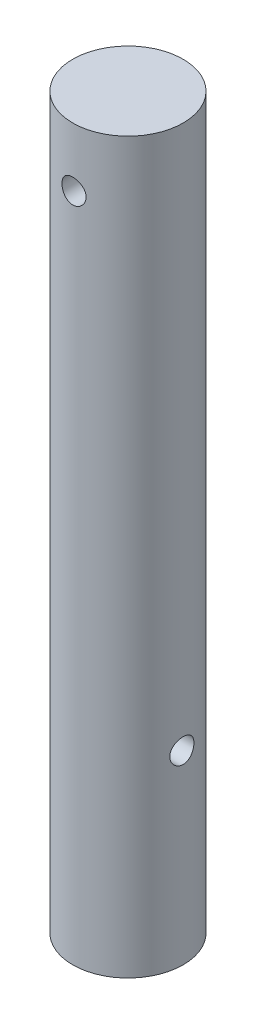
ISO-10303-21;
HEADER;
FILE_DESCRIPTION(('STEP AP214'),'2;1');
FILE_NAME('part.step','',(''),(''),'','','');
FILE_SCHEMA(('AUTOMOTIVE_DESIGN { 1 0 10303 214 1 1 1 1 }'));
ENDSEC;
DATA;
#1=APPLICATION_CONTEXT('core data for automotive mechanical design processes');
#2=APPLICATION_PROTOCOL_DEFINITION('international standard','automotive_design',2000,#1);
#3=PRODUCT_CONTEXT('',#1,'mechanical');
#4=PRODUCT('Part','Part','',(#3));
#5=PRODUCT_RELATED_PRODUCT_CATEGORY('part','',(#4));
#6=PRODUCT_DEFINITION_FORMATION('','',#4);
#7=PRODUCT_DEFINITION_CONTEXT('part definition',#1,'design');
#8=PRODUCT_DEFINITION('design','',#6,#7);
#9=PRODUCT_DEFINITION_SHAPE('','',#8);
#10=(LENGTH_UNIT() NAMED_UNIT(*) SI_UNIT(.MILLI.,.METRE.));
#11=(NAMED_UNIT(*) PLANE_ANGLE_UNIT() SI_UNIT($,.RADIAN.));
#12=(NAMED_UNIT(*) SI_UNIT($,.STERADIAN.) SOLID_ANGLE_UNIT());
#13=UNCERTAINTY_MEASURE_WITH_UNIT(LENGTH_MEASURE(1.E-05),#10,'distance_accuracy_value','');
#14=(GEOMETRIC_REPRESENTATION_CONTEXT(3) GLOBAL_UNCERTAINTY_ASSIGNED_CONTEXT((#13)) GLOBAL_UNIT_ASSIGNED_CONTEXT((#10,
#11,#12)) REPRESENTATION_CONTEXT('',''));
#15=CARTESIAN_POINT('',(0.,0.,0.));
#16=DIRECTION('',(0.,0.,1.));
#17=DIRECTION('',(1.,0.,0.));
#18=AXIS2_PLACEMENT_3D('',#15,#16,#17);
#19=CARTESIAN_POINT('',(0.,-9.525,0.));
#20=DIRECTION('',(0.,1.,0.));
#21=DIRECTION('',(0.,0.,1.));
#22=AXIS2_PLACEMENT_3D('',#19,#20,#21);
#23=CYLINDRICAL_SURFACE('',#22,4.7625);
#24=CARTESIAN_POINT('',(-4.64724566705915,-46.863,-1.0414));
#25=CARTESIAN_POINT('',(-4.64724683426293,-46.8052594354549,-1.04139801362496));
#26=CARTESIAN_POINT('',(-4.64833350092517,-46.7474949910105,-1.03658151779939));
#27=CARTESIAN_POINT('',(-4.65255476760777,-46.6336087908007,-1.01746386740255));
#28=CARTESIAN_POINT('',(-4.6556908487515,-46.5774882537678,-1.00315585314442));
#29=CARTESIAN_POINT('',(-4.66363917155119,-46.4685537577196,-0.965527203784959));
#30=CARTESIAN_POINT('',(-4.66844957404701,-46.4157362452833,-0.942216454681358));
#31=CARTESIAN_POINT('',(-4.679202313415,-46.3147605410028,-0.887272324034088));
#32=CARTESIAN_POINT('',(-4.68514462682847,-46.2666022526281,-0.855639114967133));
#33=CARTESIAN_POINT('',(-4.69760372982455,-46.1754981701297,-0.784378709753431));
#34=CARTESIAN_POINT('',(-4.70412786452575,-46.1326424951388,-0.744637563560157));
#35=CARTESIAN_POINT('',(-4.71695119823604,-46.0541494142651,-0.658535374425396));
#36=CARTESIAN_POINT('',(-4.72325037973522,-46.0185125692768,-0.612173817562527));
#37=CARTESIAN_POINT('',(-4.73499404437961,-45.9551123001179,-0.513542666007839));
#38=CARTESIAN_POINT('',(-4.74042885036034,-45.927435548742,-0.461216106554952));
#39=CARTESIAN_POINT('',(-4.74974844219505,-45.8813018498733,-0.352516010031967));
#40=CARTESIAN_POINT('',(-4.75363340187398,-45.8628438683793,-0.296142927642001));
#41=CARTESIAN_POINT('',(-4.75936366654546,-45.8359550886623,-0.181887019493143));
#42=CARTESIAN_POINT('',(-4.76123996378069,-45.8273717716921,-0.124041667800268));
#43=CARTESIAN_POINT('',(-4.7628488730253,-45.8199991100795,-0.00770365102984375));
#44=CARTESIAN_POINT('',(-4.76258173014628,-45.8212086455823,0.0507889392692712));
#45=CARTESIAN_POINT('',(-4.7599575457801,-45.8332737553604,0.165709632519628));
#46=CARTESIAN_POINT('',(-4.75763612363036,-45.8439649334693,0.222155927894644));
#47=CARTESIAN_POINT('',(-4.75120480370878,-45.874427878627,0.332433306696865));
#48=CARTESIAN_POINT('',(-4.74709482510063,-45.8942000561064,0.386264271798325));
#49=CARTESIAN_POINT('',(-4.7374909127541,-45.9424091815594,0.490239331884415));
#50=CARTESIAN_POINT('',(-4.73198707564586,-45.9709084521832,0.540353578110618));
#51=CARTESIAN_POINT('',(-4.72019893627285,-46.0357163000883,0.635148271211257));
#52=CARTESIAN_POINT('',(-4.71391452779004,-46.0720259406767,0.679827976927225));
#53=CARTESIAN_POINT('',(-4.70110204145526,-46.1523188534707,0.763463015113666));
#54=CARTESIAN_POINT('',(-4.69457161409702,-46.1964460039315,0.802279980264733));
#55=CARTESIAN_POINT('',(-4.68212554890455,-46.2906510439001,0.871988610824726));
#56=CARTESIAN_POINT('',(-4.67620992771903,-46.3407290944775,0.902880061646886));
#57=CARTESIAN_POINT('',(-4.66565707357456,-46.4456380473703,0.95592222957979));
#58=CARTESIAN_POINT('',(-4.66102367598321,-46.5004825776943,0.97804680680204));
#59=CARTESIAN_POINT('',(-4.65361304323723,-46.6132364055119,1.0127238472103));
#60=CARTESIAN_POINT('',(-4.65083551382603,-46.6711452155776,1.0252778279036));
#61=CARTESIAN_POINT('',(-4.64751110841383,-46.7871194979768,1.04024271000873));
#62=CARTESIAN_POINT('',(-4.64691993253734,-46.8451577340028,1.04285508035657));
#63=CARTESIAN_POINT('',(-4.64791567011152,-46.9608404403681,1.03840802942941));
#64=CARTESIAN_POINT('',(-4.6495024340223,-47.0184849374688,1.03134927218535));
#65=CARTESIAN_POINT('',(-4.65463343129432,-47.1310424003158,1.00793513212541));
#66=CARTESIAN_POINT('',(-4.65815428767504,-47.185979611458,0.99169070701029));
#67=CARTESIAN_POINT('',(-4.66673567123808,-47.2923524843477,0.950486488246564));
#68=CARTESIAN_POINT('',(-4.67179634572057,-47.3437878105258,0.925525860765657));
#69=CARTESIAN_POINT('',(-4.68298449147103,-47.4425687414898,0.867153863286206));
#70=CARTESIAN_POINT('',(-4.68912717846546,-47.4898392455922,0.833618379071799));
#71=CARTESIAN_POINT('',(-4.70174708709888,-47.5781556543828,0.75921103069977));
#72=CARTESIAN_POINT('',(-4.7082243501868,-47.6192007853498,0.718338256002518));
#73=CARTESIAN_POINT('',(-4.72092960738021,-47.6946832744679,0.629504904094955));
#74=CARTESIAN_POINT('',(-4.72715070931358,-47.7289832809665,0.581426465048818));
#75=CARTESIAN_POINT('',(-4.73851586605987,-47.7890196640495,0.480073080457866));
#76=CARTESIAN_POINT('',(-4.74365997115273,-47.814756440444,0.426798377672553));
#77=CARTESIAN_POINT('',(-4.75226247126153,-47.8567444874519,0.316896539669138));
#78=CARTESIAN_POINT('',(-4.75573151727163,-47.8730558246138,0.260293224474134));
#79=CARTESIAN_POINT('',(-4.76063908181433,-47.8959175521733,0.145065409410685));
#80=CARTESIAN_POINT('',(-4.76207789535526,-47.9024693607128,0.0864412044614987));
#81=CARTESIAN_POINT('',(-4.76275412632141,-47.9055623173701,-0.0298603228029478));
#82=CARTESIAN_POINT('',(-4.76203664219021,-47.9023085429497,-0.0875320244869774));
#83=CARTESIAN_POINT('',(-4.75857751446408,-47.8863413933666,-0.201485414812264));
#84=CARTESIAN_POINT('',(-4.75583590721532,-47.8736281880621,-0.257767128394096));
#85=CARTESIAN_POINT('',(-4.74863991195574,-47.8392013099453,-0.367184402238855));
#86=CARTESIAN_POINT('',(-4.74419105946765,-47.8175167081639,-0.420329496601131));
#87=CARTESIAN_POINT('',(-4.73405565817542,-47.765790934413,-0.522254272086121));
#88=CARTESIAN_POINT('',(-4.72836898931314,-47.7357489517668,-0.571033529110016));
#89=CARTESIAN_POINT('',(-4.71624362983928,-47.6674924311219,-0.66384231669472));
#90=CARTESIAN_POINT('',(-4.70979271994042,-47.6291336727227,-0.707764193111468));
#91=CARTESIAN_POINT('',(-4.69693179793269,-47.5456233784584,-0.78861772566919));
#92=CARTESIAN_POINT('',(-4.69052179605622,-47.5004702075537,-0.825547694400661));
#93=CARTESIAN_POINT('',(-4.67837298924523,-47.403927290551,-0.891844453069654));
#94=CARTESIAN_POINT('',(-4.67264429711009,-47.3524622742865,-0.921103592206115));
#95=CARTESIAN_POINT('',(-4.66263389205707,-47.2452313088032,-0.97051110043285));
#96=CARTESIAN_POINT('',(-4.6583509550351,-47.1894690474029,-0.990667181888034));
#97=CARTESIAN_POINT('',(-4.65250901438367,-47.0885415511845,-1.01769701357225));
#98=CARTESIAN_POINT('',(-4.65054835699366,-47.0439238549312,-1.02656858972862));
#99=CARTESIAN_POINT('',(-4.64791625537895,-46.9538756769008,-1.03842072126472));
#100=CARTESIAN_POINT('',(-4.64724474840082,-46.9084452347952,-1.04140156339449));
#101=CARTESIAN_POINT('',(-4.64724566705915,-46.863,-1.0414));
#102=B_SPLINE_CURVE_WITH_KNOTS('',3,(#24,#25,#26,#27,#28,#29,#30,#31,#32,#33,#34,#35,#36,#37,
#38,#39,#40,#41,#42,#43,#44,#45,#46,#47,#48,#49,#50,#51,#52,#53,#54,#55,#56,#57,#58,#59,#60,#61,
#62,#63,#64,#65,#66,#67,#68,#69,#70,#71,#72,#73,#74,#75,#76,#77,#78,#79,#80,#81,#82,#83,#84,#85,
#86,#87,#88,#89,#90,#91,#92,#93,#94,#95,#96,#97,#98,#99,#100,#101),.UNSPECIFIED.,.T.,.F.,(4,2,2,
2,2,2,2,2,2,2,2,2,2,2,2,2,2,2,2,2,2,2,2,2,2,2,2,2,2,2,2,2,2,2,2,2,2,2,4),(0.,0.173055140300116,
0.346235487043308,0.519226200880875,0.69221332989857,0.867823714054951,1.0434477377038,
1.22091729879004,1.39836694995534,1.57303737128947,1.74768781859339,1.9193680553078,
2.0910560521551,2.26399990258393,2.43696731257987,2.61353176331568,2.79010099410679,
2.96719280369704,3.1442565278867,3.31771229626417,3.4911561555624,3.66254834344323,
3.83395693198865,4.00800281298307,4.18207030759133,4.35938074440266,4.53668290157354,
4.71284231692531,4.88897613232749,5.06145196582417,5.23392470233289,5.40584287971858,
5.57777773920591,5.75297415311241,5.92821279473666,6.10579293444732,6.28322233975766,
6.41943358750539,6.55563820457845),.UNSPECIFIED.);
#103=CARTESIAN_POINT('',(-4.64724566705915,-46.863,-1.0414));
#104=VERTEX_POINT('',#103);
#105=EDGE_CURVE('E85',#104,#104,#102,.T.);
#106=ORIENTED_EDGE('',*,*,#105,.T.);
#107=EDGE_LOOP('',(#106));
#108=FACE_BOUND('',#107,.T.);
#109=CARTESIAN_POINT('',(4.64724566705915,-46.863,1.0414));
#110=CARTESIAN_POINT('',(4.64724683426293,-46.9207405645451,1.04139801362496));
#111=CARTESIAN_POINT('',(4.64833350092517,-46.9785050089895,1.03658151779939));
#112=CARTESIAN_POINT('',(4.65255476760777,-47.0923912091993,1.01746386740255));
#113=CARTESIAN_POINT('',(4.6556908487515,-47.1485117462322,1.00315585314442));
#114=CARTESIAN_POINT('',(4.66363917155119,-47.2574462422804,0.965527203784959));
#115=CARTESIAN_POINT('',(4.66844957404701,-47.3102637547167,0.942216454681361));
#116=CARTESIAN_POINT('',(4.679202313415,-47.4112394589972,0.887272324034091));
#117=CARTESIAN_POINT('',(4.68514462682847,-47.4593977473719,0.855639114967134));
#118=CARTESIAN_POINT('',(4.69760372982455,-47.5505018298703,0.78437870975343));
#119=CARTESIAN_POINT('',(4.70412786452575,-47.5933575048612,0.744637563560156));
#120=CARTESIAN_POINT('',(4.71695119823604,-47.671850585735,0.658535374425396));
#121=CARTESIAN_POINT('',(4.72325037973522,-47.7074874307232,0.612173817562527));
#122=CARTESIAN_POINT('',(4.73499404437961,-47.7708876998821,0.51354266600784));
#123=CARTESIAN_POINT('',(4.74042885036034,-47.798564451258,0.461216106554953));
#124=CARTESIAN_POINT('',(4.74974844219505,-47.8446981501267,0.352516010031967));
#125=CARTESIAN_POINT('',(4.75363340187398,-47.8631561316207,0.296142927642001));
#126=CARTESIAN_POINT('',(4.75936366654546,-47.8900449113377,0.181887019493144));
#127=CARTESIAN_POINT('',(4.76123996378069,-47.8986282283079,0.124041667800269));
#128=CARTESIAN_POINT('',(4.7628488730253,-47.9060008899205,0.00770365102984466));
#129=CARTESIAN_POINT('',(4.76258173014628,-47.9047913544177,-0.0507889392692702));
#130=CARTESIAN_POINT('',(4.7599575457801,-47.8927262446396,-0.165709632519627));
#131=CARTESIAN_POINT('',(4.75763612363036,-47.8820350665307,-0.222155927894643));
#132=CARTESIAN_POINT('',(4.75120480370878,-47.851572121373,-0.332433306696864));
#133=CARTESIAN_POINT('',(4.74709482510063,-47.8317999438936,-0.386264271798325));
#134=CARTESIAN_POINT('',(4.7374909127541,-47.7835908184406,-0.490239331884412));
#135=CARTESIAN_POINT('',(4.73198707564586,-47.7550915478168,-0.540353578110612));
#136=CARTESIAN_POINT('',(4.72019893627285,-47.6902836999118,-0.635148271211252));
#137=CARTESIAN_POINT('',(4.71391452779004,-47.6539740593234,-0.679827976927223));
#138=CARTESIAN_POINT('',(4.70110204145526,-47.5736811465293,-0.763463015113663));
#139=CARTESIAN_POINT('',(4.69457161409703,-47.5295539960686,-0.802279980264726));
#140=CARTESIAN_POINT('',(4.68212554890455,-47.4353489561,-0.87198861082472));
#141=CARTESIAN_POINT('',(4.67620992771903,-47.3852709055226,-0.902880061646884));
#142=CARTESIAN_POINT('',(4.66565707357456,-47.2803619526297,-0.95592222957979));
#143=CARTESIAN_POINT('',(4.66102367598321,-47.2255174223057,-0.97804680680204));
#144=CARTESIAN_POINT('',(4.65361304323723,-47.1127635944881,-1.0127238472103));
#145=CARTESIAN_POINT('',(4.65083551382603,-47.0548547844224,-1.0252778279036));
#146=CARTESIAN_POINT('',(4.64751110841383,-46.9388805020232,-1.04024271000873));
#147=CARTESIAN_POINT('',(4.64691993253734,-46.8808422659972,-1.04285508035657));
#148=CARTESIAN_POINT('',(4.64791567011152,-46.7651595596319,-1.03840802942941));
#149=CARTESIAN_POINT('',(4.6495024340223,-46.7075150625312,-1.03134927218535));
#150=CARTESIAN_POINT('',(4.65463343129432,-46.5949575996842,-1.00793513212541));
#151=CARTESIAN_POINT('',(4.65815428767504,-46.540020388542,-0.991690707010291));
#152=CARTESIAN_POINT('',(4.66673567123808,-46.4336475156523,-0.950486488246564));
#153=CARTESIAN_POINT('',(4.67179634572057,-46.3822121894742,-0.925525860765656));
#154=CARTESIAN_POINT('',(4.68298449147103,-46.2834312585102,-0.867153863286207));
#155=CARTESIAN_POINT('',(4.68912717846546,-46.2361607544078,-0.833618379071802));
#156=CARTESIAN_POINT('',(4.70174708709888,-46.1478443456172,-0.759211030699773));
#157=CARTESIAN_POINT('',(4.7082243501868,-46.1067992146502,-0.718338256002519));
#158=CARTESIAN_POINT('',(4.72092960738021,-46.0313167255321,-0.629504904094953));
#159=CARTESIAN_POINT('',(4.72715070931358,-45.9970167190335,-0.581426465048817));
#160=CARTESIAN_POINT('',(4.73851586605987,-45.9369803359505,-0.480073080457864));
#161=CARTESIAN_POINT('',(4.74365997115273,-45.911243559556,-0.426798377672552));
#162=CARTESIAN_POINT('',(4.75226247126153,-45.8692555125481,-0.316896539669137));
#163=CARTESIAN_POINT('',(4.75573151727163,-45.8529441753862,-0.260293224474134));
#164=CARTESIAN_POINT('',(4.76063908181433,-45.8300824478267,-0.145065409410685));
#165=CARTESIAN_POINT('',(4.76207789535526,-45.8235306392872,-0.0864412044614986));
#166=CARTESIAN_POINT('',(4.76275412632141,-45.8204376826299,0.0298603228029479));
#167=CARTESIAN_POINT('',(4.76203664219021,-45.8236914570503,0.0875320244869773));
#168=CARTESIAN_POINT('',(4.75857751446408,-45.8396586066334,0.201485414812263));
#169=CARTESIAN_POINT('',(4.75583590721532,-45.8523718119379,0.257767128394096));
#170=CARTESIAN_POINT('',(4.74863991195574,-45.8867986900547,0.367184402238855));
#171=CARTESIAN_POINT('',(4.74419105946765,-45.9084832918361,0.420329496601131));
#172=CARTESIAN_POINT('',(4.73405565817542,-45.960209065587,0.522254272086121));
#173=CARTESIAN_POINT('',(4.72836898931314,-45.9902510482332,0.571033529110016));
#174=CARTESIAN_POINT('',(4.71624362983928,-46.0585075688781,0.66384231669472));
#175=CARTESIAN_POINT('',(4.70979271994042,-46.0968663272773,0.707764193111468));
#176=CARTESIAN_POINT('',(4.69693179793269,-46.1803766215417,0.788617725669189));
#177=CARTESIAN_POINT('',(4.69052179605622,-46.2255297924464,0.825547694400661));
#178=CARTESIAN_POINT('',(4.67837298924523,-46.322072709449,0.891844453069654));
#179=CARTESIAN_POINT('',(4.67264429711009,-46.3735377257135,0.921103592206115));
#180=CARTESIAN_POINT('',(4.66263389205707,-46.4807686911968,0.97051110043285));
#181=CARTESIAN_POINT('',(4.6583509550351,-46.5365309525971,0.990667181888033));
#182=CARTESIAN_POINT('',(4.65250901438367,-46.6374584488155,1.01769701357225));
#183=CARTESIAN_POINT('',(4.65054835699367,-46.6820761450687,1.02656858972861));
#184=CARTESIAN_POINT('',(4.64791625537895,-46.7721243230992,1.03842072126472));
#185=CARTESIAN_POINT('',(4.64724474840082,-46.8175547652048,1.04140156339449));
#186=CARTESIAN_POINT('',(4.64724566705915,-46.863,1.0414));
#187=B_SPLINE_CURVE_WITH_KNOTS('',3,(#109,#110,#111,#112,#113,#114,#115,#116,#117,#118,#119,
#120,#121,#122,#123,#124,#125,#126,#127,#128,#129,#130,#131,#132,#133,#134,#135,#136,#137,#138,
#139,#140,#141,#142,#143,#144,#145,#146,#147,#148,#149,#150,#151,#152,#153,#154,#155,#156,#157,
#158,#159,#160,#161,#162,#163,#164,#165,#166,#167,#168,#169,#170,#171,#172,#173,#174,#175,#176,
#177,#178,#179,#180,#181,#182,#183,#184,#185,#186),.UNSPECIFIED.,.T.,.F.,(4,2,2,2,2,2,2,2,2,2,2,
2,2,2,2,2,2,2,2,2,2,2,2,2,2,2,2,2,2,2,2,2,2,2,2,2,2,2,4),(0.,0.173055140300116,
0.346235487043308,0.519226200880874,0.692213329898571,0.867823714054952,1.0434477377038,
1.22091729879004,1.39836694995534,1.57303737128947,1.74768781859339,1.9193680553078,
2.0910560521551,2.26399990258392,2.43696731257987,2.61353176331566,2.79010099410679,
2.96719280369704,3.1442565278867,3.31771229626417,3.4911561555624,3.66254834344323,
3.83395693198865,4.00800281298306,4.18207030759133,4.35938074440266,4.53668290157354,
4.71284231692531,4.88897613232749,5.06145196582417,5.23392470233289,5.40584287971858,
5.57777773920591,5.75297415311241,5.92821279473666,6.10579293444732,6.28322233975766,
6.41943358750537,6.55563820457845),.UNSPECIFIED.);
#188=CARTESIAN_POINT('',(4.64724566705915,-46.863,1.0414));
#189=VERTEX_POINT('',#188);
#190=EDGE_CURVE('E89',#189,#189,#187,.T.);
#191=ORIENTED_EDGE('',*,*,#190,.F.);
#192=EDGE_LOOP('',(#191));
#193=FACE_BOUND('',#192,.T.);
#194=CARTESIAN_POINT('',(-1.0414,-5.08,4.64724566705915));
#195=CARTESIAN_POINT('',(-1.04139801362496,-5.1377405645451,4.64724683426293));
#196=CARTESIAN_POINT('',(-1.03658151779939,-5.19550500898947,4.64833350092517));
#197=CARTESIAN_POINT('',(-1.01746386740255,-5.30939120919932,4.65255476760777));
#198=CARTESIAN_POINT('',(-1.00315585314442,-5.36551174623215,4.6556908487515));
#199=CARTESIAN_POINT('',(-0.965527203784957,-5.47444624228043,4.66363917155119));
#200=CARTESIAN_POINT('',(-0.942216454681359,-5.52726375471671,4.66844957404701));
#201=CARTESIAN_POINT('',(-0.88727232403409,-5.62823945899716,4.679202313415));
#202=CARTESIAN_POINT('',(-0.855639114967134,-5.67639774737194,4.68514462682847));
#203=CARTESIAN_POINT('',(-0.784378709753432,-5.76750182987032,4.69760372982455));
#204=CARTESIAN_POINT('',(-0.744637563560157,-5.81035750486115,4.70412786452575));
#205=CARTESIAN_POINT('',(-0.658535374425396,-5.88885058573494,4.71695119823604));
#206=CARTESIAN_POINT('',(-0.612173817562526,-5.92448743072324,4.72325037973522));
#207=CARTESIAN_POINT('',(-0.513542666007838,-5.98788769988214,4.73499404437961));
#208=CARTESIAN_POINT('',(-0.461216106554951,-6.01556445125803,4.74042885036034));
#209=CARTESIAN_POINT('',(-0.352516010031965,-6.06169815012671,4.74974844219505));
#210=CARTESIAN_POINT('',(-0.296142927641999,-6.08015613162073,4.75363340187398));
#211=CARTESIAN_POINT('',(-0.181887019493141,-6.10704491133772,4.75936366654545));
#212=CARTESIAN_POINT('',(-0.124041667800267,-6.11562822830789,4.76123996378069));
#213=CARTESIAN_POINT('',(-0.00770365102984294,-6.12300088992053,4.7628488730253));
#214=CARTESIAN_POINT('',(0.0507889392692714,-6.12179135441771,4.76258173014628));
#215=CARTESIAN_POINT('',(0.165709632519628,-6.10972624463959,4.7599575457801));
#216=CARTESIAN_POINT('',(0.222155927894645,-6.09903506653072,4.75763612363036));
#217=CARTESIAN_POINT('',(0.332433306696866,-6.06857212137304,4.75120480370878));
#218=CARTESIAN_POINT('',(0.386264271798326,-6.0487999438936,4.74709482510063));
#219=CARTESIAN_POINT('',(0.490239331884414,-6.0005908184406,4.7374909127541));
#220=CARTESIAN_POINT('',(0.540353578110617,-5.97209154781684,4.73198707564586));
#221=CARTESIAN_POINT('',(0.635148271211256,-5.90728369991175,4.72019893627285));
#222=CARTESIAN_POINT('',(0.679827976927225,-5.87097405932335,4.71391452779004));
#223=CARTESIAN_POINT('',(0.763463015113664,-5.79068114652927,4.70110204145526));
#224=CARTESIAN_POINT('',(0.802279980264728,-5.74655399606855,4.69457161409702));
#225=CARTESIAN_POINT('',(0.871988610824721,-5.65234895609995,4.68212554890455));
#226=CARTESIAN_POINT('',(0.902880061646884,-5.60227090552255,4.67620992771903));
#227=CARTESIAN_POINT('',(0.955922229579789,-5.49736195262965,4.66565707357456));
#228=CARTESIAN_POINT('',(0.978046806802039,-5.44251742230574,4.66102367598321));
#229=CARTESIAN_POINT('',(1.0127238472103,-5.32976359448813,4.65361304323723));
#230=CARTESIAN_POINT('',(1.0252778279036,-5.27185478442239,4.65083551382603));
#231=CARTESIAN_POINT('',(1.04024271000873,-5.15588050202321,4.64751110841383));
#232=CARTESIAN_POINT('',(1.04285508035657,-5.09784226599718,4.64691993253734));
#233=CARTESIAN_POINT('',(1.03840802942941,-4.98215955963193,4.64791567011152));
#234=CARTESIAN_POINT('',(1.03134927218535,-4.92451506253123,4.6495024340223));
#235=CARTESIAN_POINT('',(1.00793513212541,-4.81195759968417,4.65463343129432));
#236=CARTESIAN_POINT('',(0.99169070701029,-4.75702038854196,4.65815428767504));
#237=CARTESIAN_POINT('',(0.950486488246564,-4.65064751565233,4.66673567123808));
#238=CARTESIAN_POINT('',(0.925525860765655,-4.59921218947419,4.67179634572057));
#239=CARTESIAN_POINT('',(0.867153863286205,-4.50043125851024,4.68298449147103));
#240=CARTESIAN_POINT('',(0.8336183790718,-4.45316075440777,4.68912717846546));
#241=CARTESIAN_POINT('',(0.75921103069977,-4.36484434561723,4.70174708709888));
#242=CARTESIAN_POINT('',(0.718338256002515,-4.32379921465023,4.7082243501868));
#243=CARTESIAN_POINT('',(0.62950490409495,-4.24831672553206,4.72092960738021));
#244=CARTESIAN_POINT('',(0.581426465048814,-4.21401671903347,4.72715070931358));
#245=CARTESIAN_POINT('',(0.480073080457863,-4.15398033595051,4.73851586605987));
#246=CARTESIAN_POINT('',(0.426798377672552,-4.12824355955597,4.74365997115273));
#247=CARTESIAN_POINT('',(0.316896539669137,-4.0862555125481,4.75226247126153));
#248=CARTESIAN_POINT('',(0.260293224474134,-4.06994417538617,4.75573151727163));
#249=CARTESIAN_POINT('',(0.145065409410684,-4.04708244782672,4.76063908181433));
#250=CARTESIAN_POINT('',(0.0864412044614981,-4.04053063928721,4.76207789535526));
#251=CARTESIAN_POINT('',(-0.0298603228029482,-4.03743768262992,4.76275412632141));
#252=CARTESIAN_POINT('',(-0.0875320244869775,-4.04069145705028,4.76203664219021));
#253=CARTESIAN_POINT('',(-0.201485414812264,-4.05665860663344,4.75857751446408));
#254=CARTESIAN_POINT('',(-0.257767128394097,-4.06937181193795,4.75583590721532));
#255=CARTESIAN_POINT('',(-0.367184402238857,-4.10379869005474,4.74863991195574));
#256=CARTESIAN_POINT('',(-0.420329496601133,-4.12548329183608,4.74419105946765));
#257=CARTESIAN_POINT('',(-0.522254272086122,-4.17720906558699,4.73405565817542));
#258=CARTESIAN_POINT('',(-0.571033529110016,-4.2072510482332,4.72836898931314));
#259=CARTESIAN_POINT('',(-0.663842316694721,-4.27550756887815,4.71624362983928));
#260=CARTESIAN_POINT('',(-0.70776419311147,-4.31386632727733,4.70979271994042));
#261=CARTESIAN_POINT('',(-0.788617725669192,-4.39737662154165,4.69693179793269));
#262=CARTESIAN_POINT('',(-0.825547694400662,-4.44252979244635,4.69052179605622));
#263=CARTESIAN_POINT('',(-0.891844453069654,-4.53907270944899,4.67837298924523));
#264=CARTESIAN_POINT('',(-0.921103592206116,-4.59053772571349,4.67264429711009));
#265=CARTESIAN_POINT('',(-0.970511100432851,-4.69776869119684,4.66263389205707));
#266=CARTESIAN_POINT('',(-0.990667181888034,-4.75353095259707,4.6583509550351));
#267=CARTESIAN_POINT('',(-1.01769701357225,-4.85445844881553,4.65250901438367));
#268=CARTESIAN_POINT('',(-1.02656858972861,-4.89907614506876,4.65054835699367));
#269=CARTESIAN_POINT('',(-1.03842072126472,-4.98912432309922,4.64791625537895));
#270=CARTESIAN_POINT('',(-1.04140156339449,-5.03455476520484,4.64724474840082));
#271=CARTESIAN_POINT('',(-1.0414,-5.08,4.64724566705915));
#272=B_SPLINE_CURVE_WITH_KNOTS('',3,(#194,#195,#196,#197,#198,#199,#200,#201,#202,#203,#204,
#205,#206,#207,#208,#209,#210,#211,#212,#213,#214,#215,#216,#217,#218,#219,#220,#221,#222,#223,
#224,#225,#226,#227,#228,#229,#230,#231,#232,#233,#234,#235,#236,#237,#238,#239,#240,#241,#242,
#243,#244,#245,#246,#247,#248,#249,#250,#251,#252,#253,#254,#255,#256,#257,#258,#259,#260,#261,
#262,#263,#264,#265,#266,#267,#268,#269,#270,#271),.UNSPECIFIED.,.T.,.F.,(4,2,2,2,2,2,2,2,2,2,2,
2,2,2,2,2,2,2,2,2,2,2,2,2,2,2,2,2,2,2,2,2,2,2,2,2,2,2,4),(0.,0.173055140300112,0.34623548704331,
0.519226200880874,0.692213329898566,0.867823714054948,1.0434477377038,1.22091729879004,
1.39836694995534,1.57303737128947,1.74768781859339,1.9193680553078,2.09105605215509,
2.26399990258392,2.43696731257987,2.61353176331566,2.79010099410678,2.96719280369704,
3.1442565278867,3.31771229626416,3.4911561555624,3.66254834344322,3.83395693198864,
4.00800281298306,4.18207030759133,4.35938074440266,4.53668290157354,4.7128423169253,
4.88897613232748,5.06145196582416,5.23392470233288,5.40584287971857,5.5777777392059,
5.7529741531124,5.92821279473666,6.10579293444731,6.28322233975766,6.41943358750538,
6.55563820457844),.UNSPECIFIED.);
#273=CARTESIAN_POINT('',(-1.0414,-5.08,4.64724566705915));
#274=VERTEX_POINT('',#273);
#275=EDGE_CURVE('E54',#274,#274,#272,.T.);
#276=ORIENTED_EDGE('',*,*,#275,.F.);
#277=EDGE_LOOP('',(#276));
#278=FACE_BOUND('',#277,.T.);
#279=CARTESIAN_POINT('',(1.0414,-5.08,-4.64724566705915));
#280=CARTESIAN_POINT('',(1.04139801362496,-5.02225943545491,-4.64724683426293));
#281=CARTESIAN_POINT('',(1.03658151779939,-4.96449499101053,-4.64833350092517));
#282=CARTESIAN_POINT('',(1.01746386740255,-4.85060879080068,-4.65255476760777));
#283=CARTESIAN_POINT('',(1.00315585314442,-4.79448825376785,-4.6556908487515));
#284=CARTESIAN_POINT('',(0.965527203784957,-4.68555375771957,-4.66363917155119));
#285=CARTESIAN_POINT('',(0.942216454681358,-4.63273624528329,-4.66844957404701));
#286=CARTESIAN_POINT('',(0.88727232403409,-4.53176054100285,-4.679202313415));
#287=CARTESIAN_POINT('',(0.855639114967134,-4.48360225262806,-4.68514462682847));
#288=CARTESIAN_POINT('',(0.784378709753432,-4.39249817012968,-4.69760372982455));
#289=CARTESIAN_POINT('',(0.744637563560157,-4.34964249513885,-4.70412786452575));
#290=CARTESIAN_POINT('',(0.658535374425396,-4.27114941426506,-4.71695119823604));
#291=CARTESIAN_POINT('',(0.612173817562527,-4.23551256927676,-4.72325037973522));
#292=CARTESIAN_POINT('',(0.513542666007839,-4.17211230011786,-4.73499404437961));
#293=CARTESIAN_POINT('',(0.461216106554952,-4.14443554874197,-4.74042885036034));
#294=CARTESIAN_POINT('',(0.352516010031965,-4.09830184987329,-4.74974844219505));
#295=CARTESIAN_POINT('',(0.296142927641999,-4.07984386837927,-4.75363340187398));
#296=CARTESIAN_POINT('',(0.181887019493142,-4.05295508866228,-4.75936366654545));
#297=CARTESIAN_POINT('',(0.124041667800267,-4.04437177169211,-4.76123996378069));
#298=CARTESIAN_POINT('',(0.00770365102984329,-4.03699911007947,-4.7628488730253));
#299=CARTESIAN_POINT('',(-0.050788939269271,-4.03820864558229,-4.76258173014628));
#300=CARTESIAN_POINT('',(-0.165709632519628,-4.05027375536041,-4.7599575457801));
#301=CARTESIAN_POINT('',(-0.222155927894644,-4.06096493346928,-4.75763612363036));
#302=CARTESIAN_POINT('',(-0.332433306696865,-4.09142787862696,-4.75120480370878));
#303=CARTESIAN_POINT('',(-0.386264271798326,-4.11120005610639,-4.74709482510063));
#304=CARTESIAN_POINT('',(-0.490239331884414,-4.15940918155941,-4.7374909127541));
#305=CARTESIAN_POINT('',(-0.540353578110617,-4.18790845218316,-4.73198707564586));
#306=CARTESIAN_POINT('',(-0.635148271211256,-4.25271630008825,-4.72019893627285));
#307=CARTESIAN_POINT('',(-0.679827976927225,-4.28902594067665,-4.71391452779004));
#308=CARTESIAN_POINT('',(-0.763463015113664,-4.36931885347073,-4.70110204145526));
#309=CARTESIAN_POINT('',(-0.802279980264728,-4.41344600393145,-4.69457161409702));
#310=CARTESIAN_POINT('',(-0.871988610824721,-4.50765104390005,-4.68212554890455));
#311=CARTESIAN_POINT('',(-0.902880061646884,-4.55772909447745,-4.67620992771903));
#312=CARTESIAN_POINT('',(-0.955922229579789,-4.66263804737035,-4.66565707357456));
#313=CARTESIAN_POINT('',(-0.978046806802039,-4.71748257769426,-4.66102367598321));
#314=CARTESIAN_POINT('',(-1.0127238472103,-4.83023640551187,-4.65361304323723));
#315=CARTESIAN_POINT('',(-1.0252778279036,-4.88814521557761,-4.65083551382603));
#316=CARTESIAN_POINT('',(-1.04024271000873,-5.00411949797679,-4.64751110841383));
#317=CARTESIAN_POINT('',(-1.04285508035657,-5.06215773400282,-4.64691993253734));
#318=CARTESIAN_POINT('',(-1.03840802942941,-5.17784044036808,-4.64791567011152));
#319=CARTESIAN_POINT('',(-1.03134927218535,-5.23548493746877,-4.6495024340223));
#320=CARTESIAN_POINT('',(-1.00793513212541,-5.34804240031583,-4.65463343129432));
#321=CARTESIAN_POINT('',(-0.99169070701029,-5.40297961145804,-4.65815428767504));
#322=CARTESIAN_POINT('',(-0.950486488246564,-5.50935248434767,-4.66673567123808));
#323=CARTESIAN_POINT('',(-0.925525860765655,-5.56078781052581,-4.67179634572057));
#324=CARTESIAN_POINT('',(-0.867153863286206,-5.65956874148976,-4.68298449147103));
#325=CARTESIAN_POINT('',(-0.8336183790718,-5.70683924559223,-4.68912717846546));
#326=CARTESIAN_POINT('',(-0.759211030699769,-5.79515565438277,-4.70174708709888));
#327=CARTESIAN_POINT('',(-0.718338256002515,-5.83620078534977,-4.7082243501868));
#328=CARTESIAN_POINT('',(-0.62950490409495,-5.91168327446794,-4.72092960738021));
#329=CARTESIAN_POINT('',(-0.581426465048814,-5.94598328096653,-4.72715070931358));
#330=CARTESIAN_POINT('',(-0.480073080457863,-6.00601966404949,-4.73851586605987));
#331=CARTESIAN_POINT('',(-0.426798377672552,-6.03175644044403,-4.74365997115273));
#332=CARTESIAN_POINT('',(-0.316896539669137,-6.0737444874519,-4.75226247126153));
#333=CARTESIAN_POINT('',(-0.260293224474134,-6.09005582461383,-4.75573151727163));
#334=CARTESIAN_POINT('',(-0.145065409410684,-6.11291755217328,-4.76063908181433));
#335=CARTESIAN_POINT('',(-0.086441204461498,-6.11946936071279,-4.76207789535526));
#336=CARTESIAN_POINT('',(0.0298603228029482,-6.12256231737008,-4.76275412632141));
#337=CARTESIAN_POINT('',(0.0875320244869776,-6.11930854294972,-4.76203664219021));
#338=CARTESIAN_POINT('',(0.201485414812264,-6.10334139336656,-4.75857751446408));
#339=CARTESIAN_POINT('',(0.257767128394097,-6.09062818806206,-4.75583590721532));
#340=CARTESIAN_POINT('',(0.367184402238857,-6.05620130994526,-4.74863991195574));
#341=CARTESIAN_POINT('',(0.420329496601133,-6.03451670816392,-4.74419105946765));
#342=CARTESIAN_POINT('',(0.522254272086122,-5.98279093441301,-4.73405565817542));
#343=CARTESIAN_POINT('',(0.571033529110016,-5.9527489517668,-4.72836898931314));
#344=CARTESIAN_POINT('',(0.663842316694721,-5.88449243112185,-4.71624362983928));
#345=CARTESIAN_POINT('',(0.70776419311147,-5.84613367272267,-4.70979271994042));
#346=CARTESIAN_POINT('',(0.788617725669192,-5.76262337845835,-4.69693179793269));
#347=CARTESIAN_POINT('',(0.825547694400662,-5.71747020755365,-4.69052179605622));
#348=CARTESIAN_POINT('',(0.891844453069654,-5.62092729055102,-4.67837298924523));
#349=CARTESIAN_POINT('',(0.921103592206116,-5.56946227428651,-4.67264429711009));
#350=CARTESIAN_POINT('',(0.970511100432851,-5.46223130880316,-4.66263389205707));
#351=CARTESIAN_POINT('',(0.990667181888034,-5.40646904740293,-4.6583509550351));
#352=CARTESIAN_POINT('',(1.01769701357225,-5.30554155118447,-4.65250901438367));
#353=CARTESIAN_POINT('',(1.02656858972861,-5.26092385493124,-4.65054835699367));
#354=CARTESIAN_POINT('',(1.03842072126472,-5.17087567690078,-4.64791625537895));
#355=CARTESIAN_POINT('',(1.04140156339449,-5.12544523479516,-4.64724474840082));
#356=CARTESIAN_POINT('',(1.0414,-5.08,-4.64724566705915));
#357=B_SPLINE_CURVE_WITH_KNOTS('',3,(#279,#280,#281,#282,#283,#284,#285,#286,#287,#288,#289,
#290,#291,#292,#293,#294,#295,#296,#297,#298,#299,#300,#301,#302,#303,#304,#305,#306,#307,#308,
#309,#310,#311,#312,#313,#314,#315,#316,#317,#318,#319,#320,#321,#322,#323,#324,#325,#326,#327,
#328,#329,#330,#331,#332,#333,#334,#335,#336,#337,#338,#339,#340,#341,#342,#343,#344,#345,#346,
#347,#348,#349,#350,#351,#352,#353,#354,#355,#356),.UNSPECIFIED.,.T.,.F.,(4,2,2,2,2,2,2,2,2,2,2,
2,2,2,2,2,2,2,2,2,2,2,2,2,2,2,2,2,2,2,2,2,2,2,2,2,2,2,4),(0.,0.173055140300112,0.34623548704331,
0.519226200880874,0.692213329898566,0.867823714054948,1.0434477377038,1.22091729879004,
1.39836694995534,1.57303737128947,1.74768781859339,1.9193680553078,2.09105605215509,
2.26399990258392,2.43696731257987,2.61353176331566,2.79010099410678,2.96719280369704,
3.1442565278867,3.31771229626416,3.4911561555624,3.66254834344322,3.83395693198864,
4.00800281298306,4.18207030759133,4.35938074440266,4.53668290157354,4.7128423169253,
4.88897613232748,5.06145196582416,5.23392470233288,5.40584287971857,5.5777777392059,
5.7529741531124,5.92821279473666,6.10579293444731,6.28322233975766,6.41943358750538,
6.55563820457844),.UNSPECIFIED.);
#358=CARTESIAN_POINT('',(1.0414,-5.08,-4.64724566705915));
#359=VERTEX_POINT('',#358);
#360=EDGE_CURVE('E49',#359,#359,#357,.T.);
#361=ORIENTED_EDGE('',*,*,#360,.T.);
#362=EDGE_LOOP('',(#361));
#363=FACE_BOUND('',#362,.T.);
#364=CARTESIAN_POINT('',(0.,0.,0.));
#365=DIRECTION('',(0.,1.,0.));
#366=DIRECTION('',(0.,0.,1.));
#367=AXIS2_PLACEMENT_3D('',#364,#365,#366);
#368=CIRCLE('',#367,4.7625);
#369=CARTESIAN_POINT('',(0.,0.,4.7625));
#370=VERTEX_POINT('',#369);
#371=EDGE_CURVE('E10',#370,#370,#368,.T.);
#372=ORIENTED_EDGE('',*,*,#371,.F.);
#373=EDGE_LOOP('',(#372));
#374=FACE_BOUND('',#373,.T.);
#375=CARTESIAN_POINT('',(0.,-62.865,0.));
#376=DIRECTION('',(0.,-1.,0.));
#377=DIRECTION('',(0.,0.,-1.));
#378=AXIS2_PLACEMENT_3D('',#375,#376,#377);
#379=CIRCLE('',#378,4.7625);
#380=CARTESIAN_POINT('',(0.,-62.865,-4.7625));
#381=VERTEX_POINT('',#380);
#382=EDGE_CURVE('E44',#381,#381,#379,.T.);
#383=ORIENTED_EDGE('',*,*,#382,.F.);
#384=EDGE_LOOP('',(#383));
#385=FACE_BOUND('',#384,.T.);
#386=ADVANCED_FACE('F37',(#108,#193,#278,#363,#374,#385),#23,.T.);
#387=CARTESIAN_POINT('',(0.,0.,0.));
#388=DIRECTION('',(0.,1.,0.));
#389=DIRECTION('',(0.,0.,1.));
#390=AXIS2_PLACEMENT_3D('',#387,#388,#389);
#391=PLANE('',#390);
#392=ORIENTED_EDGE('',*,*,#371,.T.);
#393=EDGE_LOOP('',(#392));
#394=FACE_BOUND('',#393,.T.);
#395=ADVANCED_FACE('F74',(#394),#391,.T.);
#396=CARTESIAN_POINT('',(0.,-62.865,0.));
#397=DIRECTION('',(0.,-1.,0.));
#398=DIRECTION('',(0.,0.,-1.));
#399=AXIS2_PLACEMENT_3D('',#396,#397,#398);
#400=PLANE('',#399);
#401=ORIENTED_EDGE('',*,*,#382,.T.);
#402=EDGE_LOOP('',(#401));
#403=FACE_BOUND('',#402,.T.);
#404=ADVANCED_FACE('F72',(#403),#400,.T.);
#405=CARTESIAN_POINT('',(0.,-5.08,-4.7635));
#406=DIRECTION('',(0.,0.,1.));
#407=DIRECTION('',(1.,0.,0.));
#408=AXIS2_PLACEMENT_3D('',#405,#406,#407);
#409=CYLINDRICAL_SURFACE('',#408,1.0414);
#410=ORIENTED_EDGE('',*,*,#360,.F.);
#411=EDGE_LOOP('',(#410));
#412=FACE_BOUND('',#411,.T.);
#413=ORIENTED_EDGE('',*,*,#275,.T.);
#414=EDGE_LOOP('',(#413));
#415=FACE_BOUND('',#414,.T.);
#416=ADVANCED_FACE('F68',(#412,#415),#409,.F.);
#417=CARTESIAN_POINT('',(-4.7635,-46.863,0.));
#418=DIRECTION('',(1.,0.,0.));
#419=DIRECTION('',(0.,0.,-1.));
#420=AXIS2_PLACEMENT_3D('',#417,#418,#419);
#421=CYLINDRICAL_SURFACE('',#420,1.0414);
#422=ORIENTED_EDGE('',*,*,#105,.F.);
#423=EDGE_LOOP('',(#422));
#424=FACE_BOUND('',#423,.T.);
#425=ORIENTED_EDGE('',*,*,#190,.T.);
#426=EDGE_LOOP('',(#425));
#427=FACE_BOUND('',#426,.T.);
#428=ADVANCED_FACE('F99',(#424,#427),#421,.F.);
#429=CLOSED_SHELL('',(#386,#395,#404,#416,#428));
#430=MANIFOLD_SOLID_BREP('B2',#429);
#431=ADVANCED_BREP_SHAPE_REPRESENTATION('',(#18,#430),#14);
#432=SHAPE_DEFINITION_REPRESENTATION(#9,#431);
ENDSEC;
END-ISO-10303-21;
